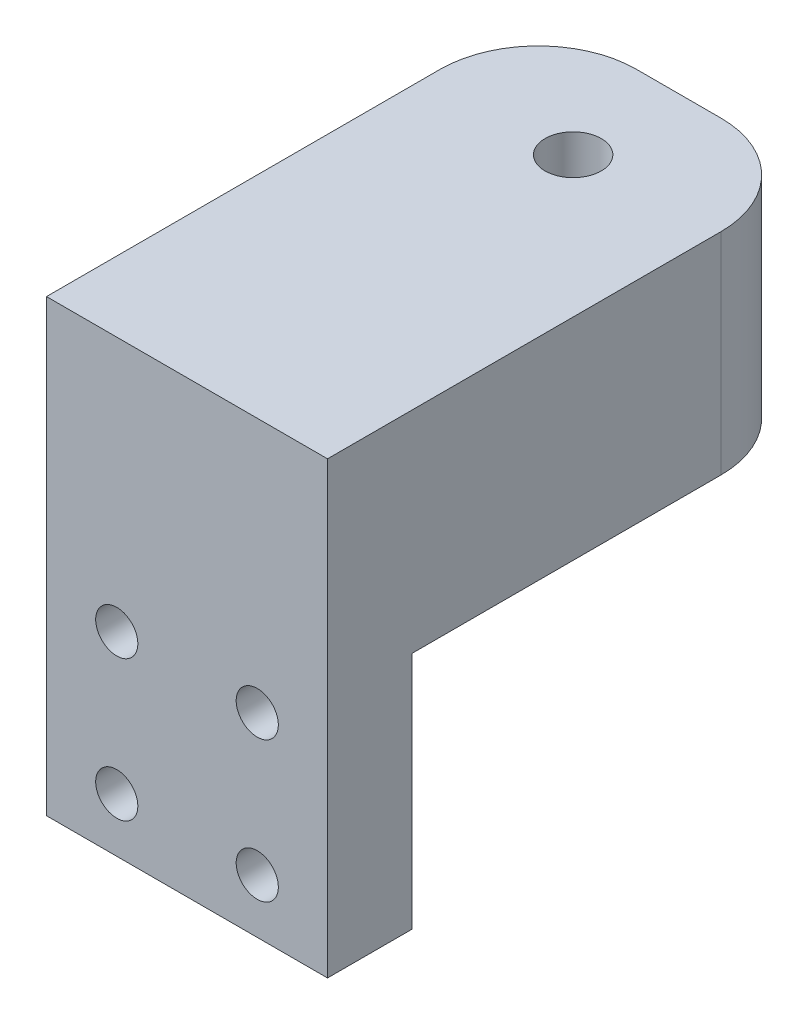
ISO-10303-21;
HEADER;
FILE_DESCRIPTION(('STEP AP214'),'2;1');
FILE_NAME('part.step','',(''),(''),'','','');
FILE_SCHEMA(('AUTOMOTIVE_DESIGN { 1 0 10303 214 1 1 1 1 }'));
ENDSEC;
DATA;
#1=APPLICATION_CONTEXT('core data for automotive mechanical design processes');
#2=APPLICATION_PROTOCOL_DEFINITION('international standard','automotive_design',2000,#1);
#3=PRODUCT_CONTEXT('',#1,'mechanical');
#4=PRODUCT('Part','Part','',(#3));
#5=PRODUCT_RELATED_PRODUCT_CATEGORY('part','',(#4));
#6=PRODUCT_DEFINITION_FORMATION('','',#4);
#7=PRODUCT_DEFINITION_CONTEXT('part definition',#1,'design');
#8=PRODUCT_DEFINITION('design','',#6,#7);
#9=PRODUCT_DEFINITION_SHAPE('','',#8);
#10=(LENGTH_UNIT() NAMED_UNIT(*) SI_UNIT(.MILLI.,.METRE.));
#11=(NAMED_UNIT(*) PLANE_ANGLE_UNIT() SI_UNIT($,.RADIAN.));
#12=(NAMED_UNIT(*) SI_UNIT($,.STERADIAN.) SOLID_ANGLE_UNIT());
#13=UNCERTAINTY_MEASURE_WITH_UNIT(LENGTH_MEASURE(1.E-05),#10,'distance_accuracy_value','');
#14=(GEOMETRIC_REPRESENTATION_CONTEXT(3) GLOBAL_UNCERTAINTY_ASSIGNED_CONTEXT((#13)) GLOBAL_UNIT_ASSIGNED_CONTEXT((#10,
#11,#12)) REPRESENTATION_CONTEXT('',''));
#15=CARTESIAN_POINT('',(0.,0.,0.));
#16=DIRECTION('',(0.,0.,1.));
#17=DIRECTION('',(1.,0.,0.));
#18=AXIS2_PLACEMENT_3D('',#15,#16,#17);
#19=CARTESIAN_POINT('',(-10.,0.,6.));
#20=DIRECTION('',(-1.,0.,0.));
#21=DIRECTION('',(0.,0.,1.));
#22=AXIS2_PLACEMENT_3D('',#19,#20,#21);
#23=PLANE('',#22);
#24=DIRECTION('',(0.,0.,1.));
#25=VECTOR('',#24,1.);
#26=CARTESIAN_POINT('',(-10.,22.,-29.));
#27=LINE('',#26,#25);
#28=CARTESIAN_POINT('',(-10.,22.,-22.));
#29=VERTEX_POINT('',#28);
#30=CARTESIAN_POINT('',(-10.,22.,6.));
#31=VERTEX_POINT('',#30);
#32=EDGE_CURVE('E229',#29,#31,#27,.T.);
#33=ORIENTED_EDGE('',*,*,#32,.F.);
#34=DIRECTION('',(0.,1.,0.));
#35=VECTOR('',#34,1.);
#36=CARTESIAN_POINT('',(-10.,-10.,-22.));
#37=LINE('',#36,#35);
#38=CARTESIAN_POINT('',(-10.,7.,-22.));
#39=VERTEX_POINT('',#38);
#40=EDGE_CURVE('E65',#39,#29,#37,.T.);
#41=ORIENTED_EDGE('',*,*,#40,.F.);
#42=DIRECTION('',(0.,0.,1.));
#43=VECTOR('',#42,1.);
#44=CARTESIAN_POINT('',(-10.,7.,-29.));
#45=LINE('',#44,#43);
#46=CARTESIAN_POINT('',(-10.,7.,0.));
#47=VERTEX_POINT('',#46);
#48=EDGE_CURVE('E142',#39,#47,#45,.T.);
#49=ORIENTED_EDGE('',*,*,#48,.T.);
#50=DIRECTION('',(0.,1.,0.));
#51=VECTOR('',#50,1.);
#52=CARTESIAN_POINT('',(-10.,0.,0.));
#53=LINE('',#52,#51);
#54=CARTESIAN_POINT('',(-10.,-10.,0.));
#55=VERTEX_POINT('',#54);
#56=EDGE_CURVE('E155',#55,#47,#53,.T.);
#57=ORIENTED_EDGE('',*,*,#56,.F.);
#58=DIRECTION('',(0.,0.,-1.));
#59=VECTOR('',#58,1.);
#60=CARTESIAN_POINT('',(-10.,-10.,6.));
#61=LINE('',#60,#59);
#62=CARTESIAN_POINT('',(-10.,-10.,6.));
#63=VERTEX_POINT('',#62);
#64=EDGE_CURVE('E50',#63,#55,#61,.T.);
#65=ORIENTED_EDGE('',*,*,#64,.F.);
#66=DIRECTION('',(0.,1.,0.));
#67=VECTOR('',#66,1.);
#68=CARTESIAN_POINT('',(-10.,0.,6.));
#69=LINE('',#68,#67);
#70=EDGE_CURVE('E174',#63,#31,#69,.T.);
#71=ORIENTED_EDGE('',*,*,#70,.T.);
#72=EDGE_LOOP('',(#33,#41,#49,#57,#65,#71));
#73=FACE_BOUND('',#72,.T.);
#74=ADVANCED_FACE('F41',(#73),#23,.T.);
#75=CARTESIAN_POINT('',(10.,7.,-29.));
#76=DIRECTION('',(0.,1.,0.));
#77=DIRECTION('',(-1.,0.,0.));
#78=AXIS2_PLACEMENT_3D('',#75,#76,#77);
#79=PLANE('',#78);
#80=CARTESIAN_POINT('',(0.,7.,-21.4822749079961));
#81=DIRECTION('',(0.,1.,0.));
#82=DIRECTION('',(-1.,0.,0.));
#83=AXIS2_PLACEMENT_3D('',#80,#81,#82);
#84=CIRCLE('',#83,2.);
#85=CARTESIAN_POINT('',(-2.,7.,-21.4822749079961));
#86=VERTEX_POINT('',#85);
#87=EDGE_CURVE('E234',#86,#86,#84,.T.);
#88=ORIENTED_EDGE('',*,*,#87,.T.);
#89=EDGE_LOOP('',(#88));
#90=FACE_BOUND('',#89,.T.);
#91=ORIENTED_EDGE('',*,*,#48,.F.);
#92=CARTESIAN_POINT('',(-2.99999999999999,7.,-22.));
#93=DIRECTION('',(0.,1.,0.));
#94=DIRECTION('',(-1.,0.,0.));
#95=AXIS2_PLACEMENT_3D('',#92,#93,#94);
#96=CIRCLE('',#95,7.);
#97=CARTESIAN_POINT('',(-2.99999999999999,7.,-29.));
#98=VERTEX_POINT('',#97);
#99=EDGE_CURVE('E218',#39,#98,#96,.F.);
#100=ORIENTED_EDGE('',*,*,#99,.T.);
#101=DIRECTION('',(-1.,0.,0.));
#102=VECTOR('',#101,1.);
#103=CARTESIAN_POINT('',(10.,7.,-29.));
#104=LINE('',#103,#102);
#105=CARTESIAN_POINT('',(3.,7.,-29.));
#106=VERTEX_POINT('',#105);
#107=EDGE_CURVE('E121',#106,#98,#104,.T.);
#108=ORIENTED_EDGE('',*,*,#107,.F.);
#109=CARTESIAN_POINT('',(3.,7.,-22.));
#110=DIRECTION('',(0.,1.,0.));
#111=DIRECTION('',(-1.,0.,0.));
#112=AXIS2_PLACEMENT_3D('',#109,#110,#111);
#113=CIRCLE('',#112,7.);
#114=CARTESIAN_POINT('',(10.,7.,-22.));
#115=VERTEX_POINT('',#114);
#116=EDGE_CURVE('E123',#115,#106,#113,.T.);
#117=ORIENTED_EDGE('',*,*,#116,.F.);
#118=DIRECTION('',(0.,0.,1.));
#119=VECTOR('',#118,1.);
#120=CARTESIAN_POINT('',(10.,7.,-29.));
#121=LINE('',#120,#119);
#122=CARTESIAN_POINT('',(10.,7.,0.));
#123=VERTEX_POINT('',#122);
#124=EDGE_CURVE('E146',#115,#123,#121,.T.);
#125=ORIENTED_EDGE('',*,*,#124,.T.);
#126=DIRECTION('',(-1.,0.,0.));
#127=VECTOR('',#126,1.);
#128=CARTESIAN_POINT('',(10.,7.,0.));
#129=LINE('',#128,#127);
#130=EDGE_CURVE('E130',#123,#47,#129,.T.);
#131=ORIENTED_EDGE('',*,*,#130,.T.);
#132=EDGE_LOOP('',(#91,#100,#108,#117,#125,#131));
#133=FACE_BOUND('',#132,.T.);
#134=ADVANCED_FACE('F217',(#90,#133),#79,.F.);
#135=CARTESIAN_POINT('',(0.,22.,0.));
#136=DIRECTION('',(0.,1.,0.));
#137=DIRECTION('',(0.,0.,1.));
#138=AXIS2_PLACEMENT_3D('',#135,#136,#137);
#139=PLANE('',#138);
#140=CARTESIAN_POINT('',(-2.99999999999999,22.,-22.));
#141=DIRECTION('',(0.,1.,0.));
#142=DIRECTION('',(0.,0.,1.));
#143=AXIS2_PLACEMENT_3D('',#140,#141,#142);
#144=CIRCLE('',#143,7.);
#145=CARTESIAN_POINT('',(-2.99999999999999,22.,-29.));
#146=VERTEX_POINT('',#145);
#147=EDGE_CURVE('E104',#29,#146,#144,.F.);
#148=ORIENTED_EDGE('',*,*,#147,.F.);
#149=ORIENTED_EDGE('',*,*,#32,.T.);
#150=DIRECTION('',(1.,0.,0.));
#151=VECTOR('',#150,1.);
#152=CARTESIAN_POINT('',(-10.,22.,6.));
#153=LINE('',#152,#151);
#154=CARTESIAN_POINT('',(10.,22.,6.));
#155=VERTEX_POINT('',#154);
#156=EDGE_CURVE('E137',#31,#155,#153,.T.);
#157=ORIENTED_EDGE('',*,*,#156,.T.);
#158=DIRECTION('',(0.,0.,-1.));
#159=VECTOR('',#158,1.);
#160=CARTESIAN_POINT('',(10.,22.,-29.));
#161=LINE('',#160,#159);
#162=CARTESIAN_POINT('',(10.,22.,-22.));
#163=VERTEX_POINT('',#162);
#164=EDGE_CURVE('E131',#155,#163,#161,.T.);
#165=ORIENTED_EDGE('',*,*,#164,.T.);
#166=CARTESIAN_POINT('',(3.,22.,-22.));
#167=DIRECTION('',(0.,1.,0.));
#168=DIRECTION('',(0.,0.,1.));
#169=AXIS2_PLACEMENT_3D('',#166,#167,#168);
#170=CIRCLE('',#169,7.);
#171=CARTESIAN_POINT('',(3.,22.,-29.));
#172=VERTEX_POINT('',#171);
#173=EDGE_CURVE('E128',#163,#172,#170,.T.);
#174=ORIENTED_EDGE('',*,*,#173,.T.);
#175=DIRECTION('',(-1.,0.,0.));
#176=VECTOR('',#175,1.);
#177=CARTESIAN_POINT('',(-10.,22.,-29.));
#178=LINE('',#177,#176);
#179=EDGE_CURVE('E119',#172,#146,#178,.T.);
#180=ORIENTED_EDGE('',*,*,#179,.T.);
#181=EDGE_LOOP('',(#148,#149,#157,#165,#174,#180));
#182=FACE_BOUND('',#181,.T.);
#183=CARTESIAN_POINT('',(0.,22.,-21.4822749079961));
#184=DIRECTION('',(0.,1.,0.));
#185=DIRECTION('',(0.,0.,1.));
#186=AXIS2_PLACEMENT_3D('',#183,#184,#185);
#187=CIRCLE('',#186,2.);
#188=CARTESIAN_POINT('',(0.,22.,-19.4822749079961));
#189=VERTEX_POINT('',#188);
#190=EDGE_CURVE('E113',#189,#189,#187,.T.);
#191=ORIENTED_EDGE('',*,*,#190,.F.);
#192=EDGE_LOOP('',(#191));
#193=FACE_BOUND('',#192,.T.);
#194=ADVANCED_FACE('F125',(#182,#193),#139,.T.);
#195=CARTESIAN_POINT('',(0.,0.,0.));
#196=DIRECTION('',(0.,0.,1.));
#197=DIRECTION('',(1.,0.,0.));
#198=AXIS2_PLACEMENT_3D('',#195,#196,#197);
#199=PLANE('',#198);
#200=CARTESIAN_POINT('',(-5.,-6.15204282368808,0.));
#201=DIRECTION('',(0.,0.,1.));
#202=DIRECTION('',(1.,0.,0.));
#203=AXIS2_PLACEMENT_3D('',#200,#201,#202);
#204=CIRCLE('',#203,1.5);
#205=CARTESIAN_POINT('',(-3.5,-6.15204282368808,0.));
#206=VERTEX_POINT('',#205);
#207=EDGE_CURVE('E189',#206,#206,#204,.T.);
#208=ORIENTED_EDGE('',*,*,#207,.T.);
#209=EDGE_LOOP('',(#208));
#210=FACE_BOUND('',#209,.T.);
#211=CARTESIAN_POINT('',(5.,3.84795717631192,0.));
#212=DIRECTION('',(0.,0.,1.));
#213=DIRECTION('',(1.,0.,0.));
#214=AXIS2_PLACEMENT_3D('',#211,#212,#213);
#215=CIRCLE('',#214,1.5);
#216=CARTESIAN_POINT('',(6.5,3.84795717631192,0.));
#217=VERTEX_POINT('',#216);
#218=EDGE_CURVE('E185',#217,#217,#215,.T.);
#219=ORIENTED_EDGE('',*,*,#218,.T.);
#220=EDGE_LOOP('',(#219));
#221=FACE_BOUND('',#220,.T.);
#222=CARTESIAN_POINT('',(-5.,3.84795717631192,0.));
#223=DIRECTION('',(0.,0.,1.));
#224=DIRECTION('',(1.,0.,0.));
#225=AXIS2_PLACEMENT_3D('',#222,#223,#224);
#226=CIRCLE('',#225,1.5);
#227=CARTESIAN_POINT('',(-3.5,3.84795717631192,0.));
#228=VERTEX_POINT('',#227);
#229=EDGE_CURVE('E181',#228,#228,#226,.T.);
#230=ORIENTED_EDGE('',*,*,#229,.T.);
#231=EDGE_LOOP('',(#230));
#232=FACE_BOUND('',#231,.T.);
#233=CARTESIAN_POINT('',(5.,-6.15204282368808,0.));
#234=DIRECTION('',(0.,0.,1.));
#235=DIRECTION('',(1.,0.,0.));
#236=AXIS2_PLACEMENT_3D('',#233,#234,#235);
#237=CIRCLE('',#236,1.5);
#238=CARTESIAN_POINT('',(6.5,-6.15204282368808,0.));
#239=VERTEX_POINT('',#238);
#240=EDGE_CURVE('E149',#239,#239,#237,.T.);
#241=ORIENTED_EDGE('',*,*,#240,.T.);
#242=EDGE_LOOP('',(#241));
#243=FACE_BOUND('',#242,.T.);
#244=ORIENTED_EDGE('',*,*,#130,.F.);
#245=DIRECTION('',(0.,1.,0.));
#246=VECTOR('',#245,1.);
#247=CARTESIAN_POINT('',(10.,0.,0.));
#248=LINE('',#247,#246);
#249=CARTESIAN_POINT('',(10.,-10.,0.));
#250=VERTEX_POINT('',#249);
#251=EDGE_CURVE('E197',#250,#123,#248,.T.);
#252=ORIENTED_EDGE('',*,*,#251,.F.);
#253=DIRECTION('',(1.,0.,0.));
#254=VECTOR('',#253,1.);
#255=CARTESIAN_POINT('',(0.,-10.,0.));
#256=LINE('',#255,#254);
#257=EDGE_CURVE('E193',#55,#250,#256,.T.);
#258=ORIENTED_EDGE('',*,*,#257,.F.);
#259=ORIENTED_EDGE('',*,*,#56,.T.);
#260=EDGE_LOOP('',(#244,#252,#258,#259));
#261=FACE_BOUND('',#260,.T.);
#262=ADVANCED_FACE('F214',(#210,#221,#232,#243,#261),#199,.F.);
#263=CARTESIAN_POINT('',(0.,-10.,6.));
#264=DIRECTION('',(0.,1.,0.));
#265=DIRECTION('',(0.,0.,1.));
#266=AXIS2_PLACEMENT_3D('',#263,#264,#265);
#267=PLANE('',#266);
#268=ORIENTED_EDGE('',*,*,#257,.T.);
#269=DIRECTION('',(0.,0.,-1.));
#270=VECTOR('',#269,1.);
#271=CARTESIAN_POINT('',(10.,-10.,6.));
#272=LINE('',#271,#270);
#273=CARTESIAN_POINT('',(10.,-10.,6.));
#274=VERTEX_POINT('',#273);
#275=EDGE_CURVE('E11',#274,#250,#272,.T.);
#276=ORIENTED_EDGE('',*,*,#275,.F.);
#277=DIRECTION('',(1.,0.,0.));
#278=VECTOR('',#277,1.);
#279=CARTESIAN_POINT('',(0.,-10.,6.));
#280=LINE('',#279,#278);
#281=EDGE_CURVE('E167',#63,#274,#280,.T.);
#282=ORIENTED_EDGE('',*,*,#281,.F.);
#283=ORIENTED_EDGE('',*,*,#64,.T.);
#284=EDGE_LOOP('',(#268,#276,#282,#283));
#285=FACE_BOUND('',#284,.T.);
#286=ADVANCED_FACE('F207',(#285),#267,.F.);
#287=CARTESIAN_POINT('',(10.,0.,6.));
#288=DIRECTION('',(-1.,0.,0.));
#289=DIRECTION('',(0.,0.,1.));
#290=AXIS2_PLACEMENT_3D('',#287,#288,#289);
#291=PLANE('',#290);
#292=ORIENTED_EDGE('',*,*,#124,.F.);
#293=DIRECTION('',(0.,1.,0.));
#294=VECTOR('',#293,1.);
#295=CARTESIAN_POINT('',(10.,-10.,-22.));
#296=LINE('',#295,#294);
#297=EDGE_CURVE('E242',#115,#163,#296,.T.);
#298=ORIENTED_EDGE('',*,*,#297,.T.);
#299=ORIENTED_EDGE('',*,*,#164,.F.);
#300=DIRECTION('',(0.,1.,0.));
#301=VECTOR('',#300,1.);
#302=CARTESIAN_POINT('',(10.,0.,6.));
#303=LINE('',#302,#301);
#304=EDGE_CURVE('E171',#274,#155,#303,.T.);
#305=ORIENTED_EDGE('',*,*,#304,.F.);
#306=ORIENTED_EDGE('',*,*,#275,.T.);
#307=ORIENTED_EDGE('',*,*,#251,.T.);
#308=EDGE_LOOP('',(#292,#298,#299,#305,#306,#307));
#309=FACE_BOUND('',#308,.T.);
#310=ADVANCED_FACE('F222',(#309),#291,.F.);
#311=CARTESIAN_POINT('',(-5.,-6.15204282368808,6.));
#312=DIRECTION('',(0.,0.,-1.));
#313=DIRECTION('',(-1.,0.,0.));
#314=AXIS2_PLACEMENT_3D('',#311,#312,#313);
#315=CYLINDRICAL_SURFACE('',#314,1.5);
#316=CARTESIAN_POINT('',(-5.,-6.15204282368808,6.));
#317=DIRECTION('',(0.,0.,1.));
#318=DIRECTION('',(1.,0.,0.));
#319=AXIS2_PLACEMENT_3D('',#316,#317,#318);
#320=CIRCLE('',#319,1.5);
#321=CARTESIAN_POINT('',(-3.5,-6.15204282368808,6.));
#322=VERTEX_POINT('',#321);
#323=EDGE_CURVE('E163',#322,#322,#320,.T.);
#324=ORIENTED_EDGE('',*,*,#323,.T.);
#325=EDGE_LOOP('',(#324));
#326=FACE_BOUND('',#325,.T.);
#327=ORIENTED_EDGE('',*,*,#207,.F.);
#328=EDGE_LOOP('',(#327));
#329=FACE_BOUND('',#328,.T.);
#330=ADVANCED_FACE('F277',(#326,#329),#315,.F.);
#331=CARTESIAN_POINT('',(5.,3.84795717631192,6.));
#332=DIRECTION('',(0.,0.,-1.));
#333=DIRECTION('',(-1.,0.,0.));
#334=AXIS2_PLACEMENT_3D('',#331,#332,#333);
#335=CYLINDRICAL_SURFACE('',#334,1.5);
#336=CARTESIAN_POINT('',(5.,3.84795717631192,6.));
#337=DIRECTION('',(0.,0.,1.));
#338=DIRECTION('',(1.,0.,0.));
#339=AXIS2_PLACEMENT_3D('',#336,#337,#338);
#340=CIRCLE('',#339,1.5);
#341=CARTESIAN_POINT('',(6.5,3.84795717631192,6.));
#342=VERTEX_POINT('',#341);
#343=EDGE_CURVE('E159',#342,#342,#340,.T.);
#344=ORIENTED_EDGE('',*,*,#343,.T.);
#345=EDGE_LOOP('',(#344));
#346=FACE_BOUND('',#345,.T.);
#347=ORIENTED_EDGE('',*,*,#218,.F.);
#348=EDGE_LOOP('',(#347));
#349=FACE_BOUND('',#348,.T.);
#350=ADVANCED_FACE('F282',(#346,#349),#335,.F.);
#351=CARTESIAN_POINT('',(-5.,3.84795717631192,6.));
#352=DIRECTION('',(0.,0.,-1.));
#353=DIRECTION('',(-1.,0.,0.));
#354=AXIS2_PLACEMENT_3D('',#351,#352,#353);
#355=CYLINDRICAL_SURFACE('',#354,1.5);
#356=CARTESIAN_POINT('',(-5.,3.84795717631192,6.));
#357=DIRECTION('',(0.,0.,1.));
#358=DIRECTION('',(1.,0.,0.));
#359=AXIS2_PLACEMENT_3D('',#356,#357,#358);
#360=CIRCLE('',#359,1.5);
#361=CARTESIAN_POINT('',(-3.5,3.84795717631192,6.));
#362=VERTEX_POINT('',#361);
#363=EDGE_CURVE('E154',#362,#362,#360,.T.);
#364=ORIENTED_EDGE('',*,*,#363,.T.);
#365=EDGE_LOOP('',(#364));
#366=FACE_BOUND('',#365,.T.);
#367=ORIENTED_EDGE('',*,*,#229,.F.);
#368=EDGE_LOOP('',(#367));
#369=FACE_BOUND('',#368,.T.);
#370=ADVANCED_FACE('F285',(#366,#369),#355,.F.);
#371=CARTESIAN_POINT('',(5.,-6.15204282368808,6.));
#372=DIRECTION('',(0.,0.,-1.));
#373=DIRECTION('',(-1.,0.,0.));
#374=AXIS2_PLACEMENT_3D('',#371,#372,#373);
#375=CYLINDRICAL_SURFACE('',#374,1.5);
#376=CARTESIAN_POINT('',(5.,-6.15204282368808,6.));
#377=DIRECTION('',(0.,0.,1.));
#378=DIRECTION('',(1.,0.,0.));
#379=AXIS2_PLACEMENT_3D('',#376,#377,#378);
#380=CIRCLE('',#379,1.5);
#381=CARTESIAN_POINT('',(6.5,-6.15204282368808,6.));
#382=VERTEX_POINT('',#381);
#383=EDGE_CURVE('E150',#382,#382,#380,.T.);
#384=ORIENTED_EDGE('',*,*,#383,.T.);
#385=EDGE_LOOP('',(#384));
#386=FACE_BOUND('',#385,.T.);
#387=ORIENTED_EDGE('',*,*,#240,.F.);
#388=EDGE_LOOP('',(#387));
#389=FACE_BOUND('',#388,.T.);
#390=ADVANCED_FACE('F43',(#386,#389),#375,.F.);
#391=CARTESIAN_POINT('',(0.,0.,6.));
#392=DIRECTION('',(0.,0.,1.));
#393=DIRECTION('',(1.,0.,0.));
#394=AXIS2_PLACEMENT_3D('',#391,#392,#393);
#395=PLANE('',#394);
#396=ORIENTED_EDGE('',*,*,#383,.F.);
#397=EDGE_LOOP('',(#396));
#398=FACE_BOUND('',#397,.T.);
#399=ORIENTED_EDGE('',*,*,#363,.F.);
#400=EDGE_LOOP('',(#399));
#401=FACE_BOUND('',#400,.T.);
#402=ORIENTED_EDGE('',*,*,#343,.F.);
#403=EDGE_LOOP('',(#402));
#404=FACE_BOUND('',#403,.T.);
#405=ORIENTED_EDGE('',*,*,#323,.F.);
#406=EDGE_LOOP('',(#405));
#407=FACE_BOUND('',#406,.T.);
#408=ORIENTED_EDGE('',*,*,#281,.T.);
#409=ORIENTED_EDGE('',*,*,#304,.T.);
#410=ORIENTED_EDGE('',*,*,#156,.F.);
#411=ORIENTED_EDGE('',*,*,#70,.F.);
#412=EDGE_LOOP('',(#408,#409,#410,#411));
#413=FACE_BOUND('',#412,.T.);
#414=ADVANCED_FACE('F228',(#398,#401,#404,#407,#413),#395,.T.);
#415=CARTESIAN_POINT('',(0.,0.,-29.));
#416=DIRECTION('',(0.,0.,-1.));
#417=DIRECTION('',(-1.,0.,0.));
#418=AXIS2_PLACEMENT_3D('',#415,#416,#417);
#419=PLANE('',#418);
#420=DIRECTION('',(0.,1.,0.));
#421=VECTOR('',#420,1.);
#422=CARTESIAN_POINT('',(-2.99999999999999,-10.,-29.));
#423=LINE('',#422,#421);
#424=EDGE_CURVE('E107',#98,#146,#423,.T.);
#425=ORIENTED_EDGE('',*,*,#424,.T.);
#426=ORIENTED_EDGE('',*,*,#179,.F.);
#427=DIRECTION('',(0.,1.,0.));
#428=VECTOR('',#427,1.);
#429=CARTESIAN_POINT('',(3.,-10.,-29.));
#430=LINE('',#429,#428);
#431=EDGE_CURVE('E57',#106,#172,#430,.T.);
#432=ORIENTED_EDGE('',*,*,#431,.F.);
#433=ORIENTED_EDGE('',*,*,#107,.T.);
#434=EDGE_LOOP('',(#425,#426,#432,#433));
#435=FACE_BOUND('',#434,.T.);
#436=ADVANCED_FACE('F118',(#435),#419,.T.);
#437=CARTESIAN_POINT('',(3.,-10.,-22.));
#438=DIRECTION('',(0.,1.,0.));
#439=DIRECTION('',(0.,0.,1.));
#440=AXIS2_PLACEMENT_3D('',#437,#438,#439);
#441=CYLINDRICAL_SURFACE('',#440,7.);
#442=ORIENTED_EDGE('',*,*,#116,.T.);
#443=ORIENTED_EDGE('',*,*,#431,.T.);
#444=ORIENTED_EDGE('',*,*,#173,.F.);
#445=ORIENTED_EDGE('',*,*,#297,.F.);
#446=EDGE_LOOP('',(#442,#443,#444,#445));
#447=FACE_BOUND('',#446,.T.);
#448=ADVANCED_FACE('F315',(#447),#441,.T.);
#449=CARTESIAN_POINT('',(0.,-10.,-21.4822749079961));
#450=DIRECTION('',(0.,1.,0.));
#451=DIRECTION('',(0.,0.,1.));
#452=AXIS2_PLACEMENT_3D('',#449,#450,#451);
#453=CYLINDRICAL_SURFACE('',#452,2.);
#454=ORIENTED_EDGE('',*,*,#190,.T.);
#455=EDGE_LOOP('',(#454));
#456=FACE_BOUND('',#455,.T.);
#457=ORIENTED_EDGE('',*,*,#87,.F.);
#458=EDGE_LOOP('',(#457));
#459=FACE_BOUND('',#458,.T.);
#460=ADVANCED_FACE('F255',(#456,#459),#453,.F.);
#461=CARTESIAN_POINT('',(-2.99999999999999,-10.,-22.));
#462=DIRECTION('',(0.,1.,0.));
#463=DIRECTION('',(0.,0.,1.));
#464=AXIS2_PLACEMENT_3D('',#461,#462,#463);
#465=CYLINDRICAL_SURFACE('',#464,7.);
#466=ORIENTED_EDGE('',*,*,#40,.T.);
#467=ORIENTED_EDGE('',*,*,#147,.T.);
#468=ORIENTED_EDGE('',*,*,#424,.F.);
#469=ORIENTED_EDGE('',*,*,#99,.F.);
#470=EDGE_LOOP('',(#466,#467,#468,#469));
#471=FACE_BOUND('',#470,.T.);
#472=ADVANCED_FACE('F106',(#471),#465,.T.);
#473=CLOSED_SHELL('',(#74,#134,#194,#262,#286,#310,#330,#350,#370,#390,#414,#436,#448,#460,#472));
#474=MANIFOLD_SOLID_BREP('B2',#473);
#475=ADVANCED_BREP_SHAPE_REPRESENTATION('',(#18,#474),#14);
#476=SHAPE_DEFINITION_REPRESENTATION(#9,#475);
ENDSEC;
END-ISO-10303-21;
